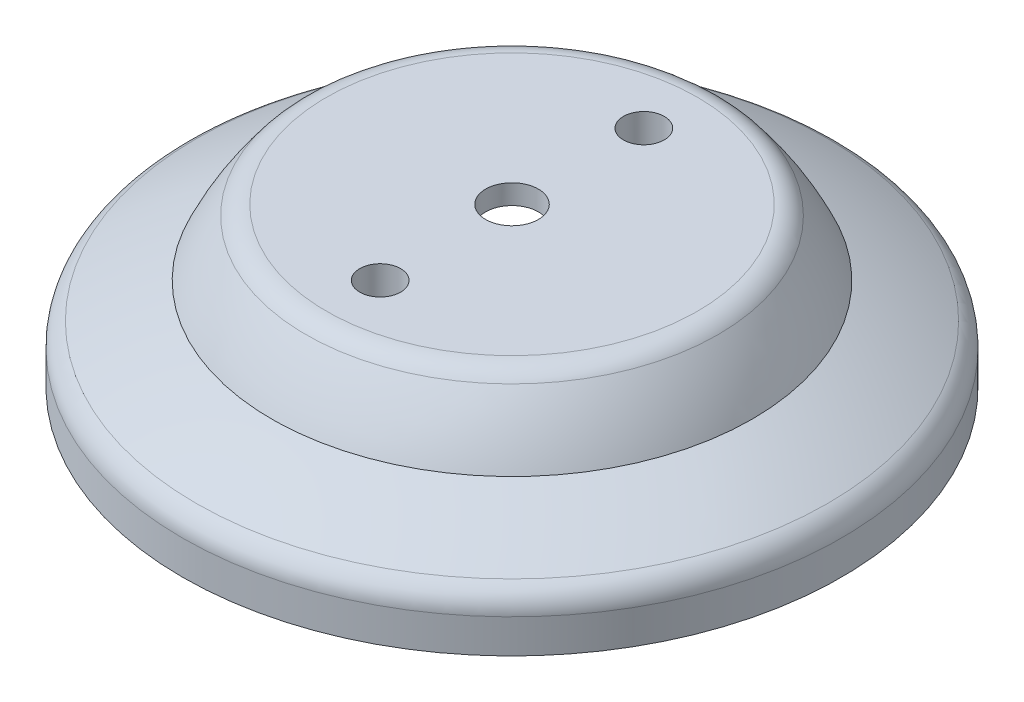
ISO-10303-21;
HEADER;
FILE_DESCRIPTION(('STEP AP214'),'2;1');
FILE_NAME('part.step','',(''),(''),'','','');
FILE_SCHEMA(('AUTOMOTIVE_DESIGN { 1 0 10303 214 1 1 1 1 }'));
ENDSEC;
DATA;
#1=APPLICATION_CONTEXT('core data for automotive mechanical design processes');
#2=APPLICATION_PROTOCOL_DEFINITION('international standard','automotive_design',2000,#1);
#3=PRODUCT_CONTEXT('',#1,'mechanical');
#4=PRODUCT('Part','Part','',(#3));
#5=PRODUCT_RELATED_PRODUCT_CATEGORY('part','',(#4));
#6=PRODUCT_DEFINITION_FORMATION('','',#4);
#7=PRODUCT_DEFINITION_CONTEXT('part definition',#1,'design');
#8=PRODUCT_DEFINITION('design','',#6,#7);
#9=PRODUCT_DEFINITION_SHAPE('','',#8);
#10=(LENGTH_UNIT() NAMED_UNIT(*) SI_UNIT(.MILLI.,.METRE.));
#11=(NAMED_UNIT(*) PLANE_ANGLE_UNIT() SI_UNIT($,.RADIAN.));
#12=(NAMED_UNIT(*) SI_UNIT($,.STERADIAN.) SOLID_ANGLE_UNIT());
#13=UNCERTAINTY_MEASURE_WITH_UNIT(LENGTH_MEASURE(1.E-05),#10,'distance_accuracy_value','');
#14=(GEOMETRIC_REPRESENTATION_CONTEXT(3) GLOBAL_UNCERTAINTY_ASSIGNED_CONTEXT((#13)) GLOBAL_UNIT_ASSIGNED_CONTEXT((#10,
#11,#12)) REPRESENTATION_CONTEXT('',''));
#15=CARTESIAN_POINT('',(0.,0.,0.));
#16=DIRECTION('',(0.,0.,1.));
#17=DIRECTION('',(1.,0.,0.));
#18=AXIS2_PLACEMENT_3D('',#15,#16,#17);
#19=CARTESIAN_POINT('',(14.3068609298467,10.5,0.));
#20=DIRECTION('',(0.,1.,0.));
#21=DIRECTION('',(-1.,0.,0.));
#22=AXIS2_PLACEMENT_3D('',#19,#20,#21);
#23=PLANE('',#22);
#24=CARTESIAN_POINT('',(0.,10.5,-10.));
#25=DIRECTION('',(0.,1.,0.));
#26=DIRECTION('',(-1.,0.,0.));
#27=AXIS2_PLACEMENT_3D('',#24,#25,#26);
#28=CIRCLE('',#27,3.05);
#29=CARTESIAN_POINT('',(-3.05,10.5,-10.));
#30=VERTEX_POINT('',#29);
#31=EDGE_CURVE('E54',#30,#30,#28,.F.);
#32=ORIENTED_EDGE('',*,*,#31,.F.);
#33=EDGE_LOOP('',(#32));
#34=FACE_BOUND('',#33,.T.);
#35=CARTESIAN_POINT('',(0.,10.5,10.));
#36=DIRECTION('',(0.,1.,0.));
#37=DIRECTION('',(-1.,0.,0.));
#38=AXIS2_PLACEMENT_3D('',#35,#36,#37);
#39=CIRCLE('',#38,3.05);
#40=CARTESIAN_POINT('',(-3.05,10.5,10.));
#41=VERTEX_POINT('',#40);
#42=EDGE_CURVE('E65',#41,#41,#39,.F.);
#43=ORIENTED_EDGE('',*,*,#42,.F.);
#44=EDGE_LOOP('',(#43));
#45=FACE_BOUND('',#44,.T.);
#46=CARTESIAN_POINT('',(0.,10.5,0.));
#47=DIRECTION('',(0.,1.,0.));
#48=DIRECTION('',(-1.,0.,0.));
#49=AXIS2_PLACEMENT_3D('',#46,#47,#48);
#50=CIRCLE('',#49,2.);
#51=CARTESIAN_POINT('',(-2.,10.5,0.));
#52=VERTEX_POINT('',#51);
#53=EDGE_CURVE('E80',#52,#52,#50,.T.);
#54=ORIENTED_EDGE('',*,*,#53,.T.);
#55=EDGE_LOOP('',(#54));
#56=FACE_BOUND('',#55,.T.);
#57=CARTESIAN_POINT('',(0.,10.5,0.));
#58=DIRECTION('',(0.,-1.,0.));
#59=DIRECTION('',(1.,0.,0.));
#60=AXIS2_PLACEMENT_3D('',#57,#58,#59);
#61=CIRCLE('',#60,14.3068609298467);
#62=CARTESIAN_POINT('',(14.3068609298467,10.5,0.));
#63=VERTEX_POINT('',#62);
#64=EDGE_CURVE('E83',#63,#63,#61,.T.);
#65=ORIENTED_EDGE('',*,*,#64,.T.);
#66=EDGE_LOOP('',(#65));
#67=FACE_BOUND('',#66,.T.);
#68=ADVANCED_FACE('F34',(#34,#45,#56,#67),#23,.F.);
#69=CARTESIAN_POINT('',(0.,10.5,0.));
#70=DIRECTION('',(0.,-1.,0.));
#71=DIRECTION('',(1.,0.,0.));
#72=AXIS2_PLACEMENT_3D('',#69,#70,#71);
#73=CYLINDRICAL_SURFACE('',#72,23.5);
#74=CARTESIAN_POINT('',(0.,2.86770806584853,0.));
#75=DIRECTION('',(0.,-1.,0.));
#76=DIRECTION('',(1.,0.,0.));
#77=AXIS2_PLACEMENT_3D('',#74,#75,#76);
#78=CIRCLE('',#77,23.5);
#79=CARTESIAN_POINT('',(23.5,2.86770806584853,0.));
#80=VERTEX_POINT('',#79);
#81=EDGE_CURVE('E90',#80,#80,#78,.T.);
#82=ORIENTED_EDGE('',*,*,#81,.F.);
#83=EDGE_LOOP('',(#82));
#84=FACE_BOUND('',#83,.T.);
#85=CARTESIAN_POINT('',(0.,0.,0.));
#86=DIRECTION('',(0.,-1.,0.));
#87=DIRECTION('',(0.,0.,-1.));
#88=AXIS2_PLACEMENT_3D('',#85,#86,#87);
#89=CIRCLE('',#88,23.5);
#90=CARTESIAN_POINT('',(0.,0.,-23.5));
#91=VERTEX_POINT('',#90);
#92=EDGE_CURVE('E58',#91,#91,#89,.T.);
#93=ORIENTED_EDGE('',*,*,#92,.T.);
#94=EDGE_LOOP('',(#93));
#95=FACE_BOUND('',#94,.T.);
#96=ADVANCED_FACE('F103',(#84,#95),#73,.F.);
#97=CARTESIAN_POINT('',(0.,-39.5586988053443,0.));
#98=DIRECTION('',(0.,-1.,0.));
#99=DIRECTION('',(1.,0.,0.));
#100=AXIS2_PLACEMENT_3D('',#97,#98,#99);
#101=SPHERICAL_SURFACE('',#100,48.5);
#102=CARTESIAN_POINT('',(0.,5.82598309941426,0.));
#103=DIRECTION('',(0.,-1.,0.));
#104=DIRECTION('',(1.,0.,0.));
#105=AXIS2_PLACEMENT_3D('',#102,#103,#104);
#106=CIRCLE('',#105,17.1020656180439);
#107=CARTESIAN_POINT('',(17.1020656180439,5.82598309941426,0.));
#108=VERTEX_POINT('',#107);
#109=EDGE_CURVE('E93',#108,#108,#106,.T.);
#110=CARTESIAN_POINT('',(17.1020656180439,5.82598309941426,0.));
#111=CARTESIAN_POINT('',(17.1708344650516,5.80006930593751,0.));
#112=CARTESIAN_POINT('',(17.2395444126264,5.77399920785923,0.));
#113=CARTESIAN_POINT('',(17.376845091056,5.72154694628821,0.));
#114=CARTESIAN_POINT('',(17.4454358219109,5.69516478279548,0.));
#115=CARTESIAN_POINT('',(17.5824966490466,5.64208893418415,0.));
#116=CARTESIAN_POINT('',(17.6509667453274,5.61539524906555,0.));
#117=CARTESIAN_POINT('',(17.7877848886135,5.56169690915612,0.));
#118=CARTESIAN_POINT('',(17.8561329356189,5.53469225436528,0.));
#119=CARTESIAN_POINT('',(17.9927055679979,5.48037253302775,0.));
#120=CARTESIAN_POINT('',(18.0609301533715,5.45305746648107,0.));
#121=CARTESIAN_POINT('',(18.1972544527294,5.39811748608653,0.));
#122=CARTESIAN_POINT('',(18.2653541667137,5.37049257223869,0.));
#123=CARTESIAN_POINT('',(18.4014273161028,5.31493346806585,0.));
#124=CARTESIAN_POINT('',(18.4694007515077,5.28699927774086,0.));
#125=CARTESIAN_POINT('',(18.6052199391606,5.23082219783745,0.));
#126=CARTESIAN_POINT('',(18.6730656914086,5.20257930825901,0.));
#127=CARTESIAN_POINT('',(18.8086281108082,5.14578541344887,0.));
#128=CARTESIAN_POINT('',(18.8763447779597,5.11723440821716,0.));
#129=CARTESIAN_POINT('',(19.0116476278938,5.05982487206804,0.));
#130=CARTESIAN_POINT('',(19.0792338106765,5.03096634115064,0.));
#131=CARTESIAN_POINT('',(19.2142742952971,4.97294234995216,0.));
#132=CARTESIAN_POINT('',(19.281728597135,4.94377688967108,0.));
#133=CARTESIAN_POINT('',(19.4165039260152,4.88513964240957,0.));
#134=CARTESIAN_POINT('',(19.4838249530575,4.85566785542914,0.));
#135=CARTESIAN_POINT('',(19.6183323412495,4.7964185637631,0.));
#136=CARTESIAN_POINT('',(19.6855187023992,4.76664105907748,0.));
#137=CARTESIAN_POINT('',(19.819755370492,4.70678094731243,0.));
#138=CARTESIAN_POINT('',(19.886805677435,4.67669834023301,0.));
#139=CARTESIAN_POINT('',(20.0207688516114,4.61622864529625,0.));
#140=CARTESIAN_POINT('',(20.0876817188448,4.58584155743893,0.));
#141=CARTESIAN_POINT('',(20.2213686309392,4.52476352885396,0.));
#142=CARTESIAN_POINT('',(20.2881426758002,4.49407258812632,0.));
#143=CARTESIAN_POINT('',(20.4215505633555,4.43238748798702,0.));
#144=CARTESIAN_POINT('',(20.4881844060498,4.40139332857536,0.));
#145=CARTESIAN_POINT('',(20.6213105123746,4.33910243151991,0.));
#146=CARTESIAN_POINT('',(20.6878027760051,4.30780569387612,0.));
#147=CARTESIAN_POINT('',(20.8206443502305,4.24491028706068,0.));
#148=CARTESIAN_POINT('',(20.8869936608254,4.21331161788903,0.));
#149=CARTESIAN_POINT('',(21.0195479579621,4.14981300096111,0.));
#150=CARTESIAN_POINT('',(21.0857529445039,4.11791305320484,0.));
#151=CARTESIAN_POINT('',(21.2180172254987,4.05381253827645,0.));
#152=CARTESIAN_POINT('',(21.2840765199518,4.02161197110433,0.));
#153=CARTESIAN_POINT('',(21.4160480517444,3.95691088272491,0.));
#154=CARTESIAN_POINT('',(21.4819602890839,3.92441036151761,0.));
#155=CARTESIAN_POINT('',(21.6136363446631,3.85911003664661,0.));
#156=CARTESIAN_POINT('',(21.6794001629029,3.82631023298292,0.));
#157=CARTESIAN_POINT('',(21.8107780213633,3.76041202096221,0.));
#158=CARTESIAN_POINT('',(21.8763920615839,3.72731361260521,0.));
#159=CARTESIAN_POINT('',(22.0074690081818,3.66081887513108,0.));
#160=CARTESIAN_POINT('',(22.0729319145589,3.62742254601396,0.));
#161=CARTESIAN_POINT('',(22.2037052407687,3.56033265710951,0.));
#162=CARTESIAN_POINT('',(22.2690156606012,3.52663909732219,0.));
#163=CARTESIAN_POINT('',(22.3994826641703,3.45895544330689,0.));
#164=CARTESIAN_POINT('',(22.4646392479068,3.4249653490789,0.));
#165=CARTESIAN_POINT('',(22.5947972329158,3.35668932854765,0.));
#166=CARTESIAN_POINT('',(22.6597986341883,3.32240340224438,0.));
#167=CARTESIAN_POINT('',(22.7896449110907,3.2535364260097,0.));
#168=CARTESIAN_POINT('',(22.8544897867206,3.21895537607828,0.));
#169=CARTESIAN_POINT('',(22.9840216724575,3.14949886724923,0.));
#170=CARTESIAN_POINT('',(23.0487086825646,3.1146234083516,0.));
#171=CARTESIAN_POINT('',(23.1779235003995,3.04457880190097,0.));
#172=CARTESIAN_POINT('',(23.2424513081273,3.00940965434797,0.));
#173=CARTESIAN_POINT('',(23.3713463885259,2.93877839858818,0.));
#174=CARTESIAN_POINT('',(23.4357136611967,2.9033162903814,0.));
#175=CARTESIAN_POINT('',(23.5,2.86770806584853,0.));
#176=B_SPLINE_CURVE_WITH_KNOTS('',3,(#110,#111,#112,#113,#114,#115,#116,#117,#118,#119,#120,
#121,#122,#123,#124,#125,#126,#127,#128,#129,#130,#131,#132,#133,#134,#135,#136,#137,#138,#139,
#140,#141,#142,#143,#144,#145,#146,#147,#148,#149,#150,#151,#152,#153,#154,#155,#156,#157,#158,
#159,#160,#161,#162,#163,#164,#165,#166,#167,#168,#169,#170,#171,#172,#173,#174,#175),
.UNSPECIFIED.,.F.,.F.,(4,2,2,2,2,2,2,2,2,2,2,2,2,2,2,2,2,2,2,2,2,2,2,2,2,2,2,2,2,2,2,2,4),(0.,
0.22046774683508,0.440935493670154,0.661403240505227,0.881870987340309,1.10233873417539,
1.32280648101046,1.54327422784553,1.76374197468062,1.9842097215157,2.20467746835077,
2.42514521518584,2.64561296202092,2.866080708856,3.08654845569107,3.30701620252615,
3.52748394936123,3.74795169619631,3.96841944303139,4.18888718986646,4.40935493670153,
4.62982268353662,4.85029043037169,5.07075817720676,5.29122592404184,5.51169367087692,
5.732161417712,5.95262916454707,6.17309691138215,6.39356465821723,6.61403240505231,
6.83450015188738,7.05496789872246),.UNSPECIFIED.);
#177=EDGE_CURVE('BSEAM132',#108,#80,#176,.T.);
#178=ORIENTED_EDGE('',*,*,#109,.F.);
#179=ORIENTED_EDGE('',*,*,#81,.T.);
#180=ORIENTED_EDGE('',*,*,#177,.T.);
#181=ORIENTED_EDGE('',*,*,#177,.F.);
#182=EDGE_LOOP('',(#178,#180,#179,#181));
#183=FACE_BOUND('',#182,.T.);
#184=ADVANCED_FACE('F132',(#183),#101,.F.);
#185=CARTESIAN_POINT('',(0.,-1.22875655532296,0.));
#186=DIRECTION('',(0.,-1.,0.));
#187=DIRECTION('',(1.,0.,0.));
#188=AXIS2_PLACEMENT_3D('',#185,#186,#187);
#189=SPHERICAL_SURFACE('',#188,18.5000000000001);
#190=CARTESIAN_POINT('',(14.3068609298467,10.5,0.));
#191=CARTESIAN_POINT('',(14.3429580487021,10.4559683664557,0.));
#192=CARTESIAN_POINT('',(14.3788518837041,10.4117700810889,0.));
#193=CARTESIAN_POINT('',(14.4502299536883,10.3230439966468,0.));
#194=CARTESIAN_POINT('',(14.4857141886707,10.2785161975714,0.));
#195=CARTESIAN_POINT('',(14.5562700263033,10.1891348756487,0.));
#196=CARTESIAN_POINT('',(14.5913416289535,10.1442813528014,0.));
#197=CARTESIAN_POINT('',(14.6610692141411,10.054252408565,0.));
#198=CARTESIAN_POINT('',(14.6957251966785,10.0090769871759,0.));
#199=CARTESIAN_POINT('',(14.7646185867832,9.91840809651063,0.));
#200=CARTESIAN_POINT('',(14.7988559943505,9.8729146272344,0.));
#201=CARTESIAN_POINT('',(14.866909316012,9.78161351910238,0.));
#202=CARTESIAN_POINT('',(14.9007252301062,9.73580588024659,0.));
#203=CARTESIAN_POINT('',(14.9679326820696,9.64388033790037,0.));
#204=CARTESIAN_POINT('',(15.0013242199387,9.59776243440993,0.));
#205=CARTESIAN_POINT('',(15.0676800729252,9.50522029422734,0.));
#206=CARTESIAN_POINT('',(15.1006443880425,9.45879605753517,0.));
#207=CARTESIAN_POINT('',(15.1661429854051,9.36564520848571,0.));
#208=CARTESIAN_POINT('',(15.1986772676505,9.31891859612842,0.));
#209=CARTESIAN_POINT('',(15.2633130258116,9.22516697906476,0.));
#210=CARTESIAN_POINT('',(15.2954145017274,9.17814197435839,0.));
#211=CARTESIAN_POINT('',(15.3591819106666,9.08379758134905,0.));
#212=CARTESIAN_POINT('',(15.3908478436899,9.03647819304608,0.));
#213=CARTESIAN_POINT('',(15.4537414674103,8.94154906669156,0.));
#214=CARTESIAN_POINT('',(15.4849691581074,8.89393932864002,0.));
#215=CARTESIAN_POINT('',(15.5469836351002,8.79843356138789,0.));
#216=CARTESIAN_POINT('',(15.577770421396,8.75053753218729,0.));
#217=CARTESIAN_POINT('',(15.6389004650973,8.65446326564212,0.));
#218=CARTESIAN_POINT('',(15.6692437225028,8.60628502829754,0.));
#219=CARTESIAN_POINT('',(15.729484121744,8.50965045252691,0.));
#220=CARTESIAN_POINT('',(15.7593812635798,8.46119411410086,0.));
#221=CARTESIAN_POINT('',(15.8187268830323,8.36400746693719,0.));
#222=CARTESIAN_POINT('',(15.848175360649,8.31527715819957,0.));
#223=CARTESIAN_POINT('',(15.9066211412615,8.21754672453785,0.));
#224=CARTESIAN_POINT('',(15.9356184442573,8.16854659961374,0.));
#225=CARTESIAN_POINT('',(15.9931594036874,8.07028071070525,0.));
#226=CARTESIAN_POINT('',(16.0217030601218,8.02101494672086,0.));
#227=CARTESIAN_POINT('',(16.0783342931606,7.92222197946298,0.));
#228=CARTESIAN_POINT('',(16.1064218697651,7.87269477618949,0.));
#229=CARTESIAN_POINT('',(16.1621385487554,7.77338315241159,0.));
#230=CARTESIAN_POINT('',(16.1897676511413,7.72359873190718,0.));
#231=CARTESIAN_POINT('',(16.2445650263891,7.62377691765266,0.));
#232=CARTESIAN_POINT('',(16.2717332992511,7.57373952390255,0.));
#233=CARTESIAN_POINT('',(16.3256066994306,7.47341602870717,0.));
#234=CARTESIAN_POINT('',(16.352311826748,7.42312992726189,0.));
#235=CARTESIAN_POINT('',(16.4052566592996,7.3223133034283,0.));
#236=CARTESIAN_POINT('',(16.4314963645336,7.27178278103998,0.));
#237=CARTESIAN_POINT('',(16.4835081160557,7.17048162290878,0.));
#238=CARTESIAN_POINT('',(16.5092801623437,7.11971098716589,0.));
#239=CARTESIAN_POINT('',(16.5603543989766,7.01793393038256,0.));
#240=CARTESIAN_POINT('',(16.5856565893215,6.96692750934212,0.));
#241=CARTESIAN_POINT('',(16.635788957129,6.86468323012248,0.));
#242=CARTESIAN_POINT('',(16.6606191345917,6.81344537194328,0.));
#243=CARTESIAN_POINT('',(16.7098053599183,6.71074258632783,0.));
#244=CARTESIAN_POINT('',(16.7341614077822,6.65927765889157,0.));
#245=CARTESIAN_POINT('',(16.78239729767,6.55612512202489,0.));
#246=CARTESIAN_POINT('',(16.8062771396939,6.50443751259446,0.));
#247=CARTESIAN_POINT('',(16.8535585820429,6.40084401789526,0.));
#248=CARTESIAN_POINT('',(16.876960182368,6.34893813262649,0.));
#249=CARTESIAN_POINT('',(16.9232831470232,6.24491251134998,0.));
#250=CARTESIAN_POINT('',(16.9462045113534,6.19279277534224,0.));
#251=CARTESIAN_POINT('',(16.9915650476987,6.08834389466298,0.));
#252=CARTESIAN_POINT('',(17.0140042197138,6.03601474999146,0.));
#253=CARTESIAN_POINT('',(17.0583984672721,5.93115151659266,0.));
#254=CARTESIAN_POINT('',(17.0803535428153,5.87861742786539,0.));
#255=CARTESIAN_POINT('',(17.102065618044,5.82598309941425,0.));
#256=B_SPLINE_CURVE_WITH_KNOTS('',3,(#190,#191,#192,#193,#194,#195,#196,#197,#198,#199,#200,
#201,#202,#203,#204,#205,#206,#207,#208,#209,#210,#211,#212,#213,#214,#215,#216,#217,#218,#219,
#220,#221,#222,#223,#224,#225,#226,#227,#228,#229,#230,#231,#232,#233,#234,#235,#236,#237,#238,
#239,#240,#241,#242,#243,#244,#245,#246,#247,#248,#249,#250,#251,#252,#253,#254,#255),
.UNSPECIFIED.,.F.,.F.,(4,2,2,2,2,2,2,2,2,2,2,2,2,2,2,2,2,2,2,2,2,2,2,2,2,2,2,2,2,2,2,2,4),(0.,
0.170809465019986,0.34161893003997,0.512428395059957,0.683237860079943,0.854047325099928,
1.02485679011991,1.1956662551399,1.36647572015988,1.53728518517987,1.70809465019985,
1.87890411521984,2.04971358023983,2.22052304525981,2.3913325102798,2.56214197529978,
2.73295144031977,2.90376090533975,3.07457037035974,3.24537983537972,3.41618930039971,
3.5869987654197,3.75780823043968,3.92861769545967,4.09942716047965,4.27023662549964,
4.44104609051962,4.61185555553961,4.78266502055959,4.95347448557958,5.12428395059956,
5.29509341561955,5.46590288063954),.UNSPECIFIED.);
#257=EDGE_CURVE('BSEAM144',#63,#108,#256,.T.);
#258=ORIENTED_EDGE('',*,*,#64,.F.);
#259=ORIENTED_EDGE('',*,*,#109,.T.);
#260=ORIENTED_EDGE('',*,*,#257,.T.);
#261=ORIENTED_EDGE('',*,*,#257,.F.);
#262=EDGE_LOOP('',(#258,#260,#259,#261));
#263=FACE_BOUND('',#262,.T.);
#264=ADVANCED_FACE('F144',(#263),#189,.F.);
#265=CARTESIAN_POINT('',(0.,6.,0.));
#266=DIRECTION('',(0.,1.,0.));
#267=DIRECTION('',(0.,0.,1.));
#268=AXIS2_PLACEMENT_3D('',#265,#266,#267);
#269=CYLINDRICAL_SURFACE('',#268,2.);
#270=CARTESIAN_POINT('',(0.,12.,0.));
#271=DIRECTION('',(0.,1.,0.));
#272=DIRECTION('',(0.,0.,1.));
#273=AXIS2_PLACEMENT_3D('',#270,#271,#272);
#274=CIRCLE('',#273,2.);
#275=CARTESIAN_POINT('',(0.,12.,2.));
#276=VERTEX_POINT('',#275);
#277=EDGE_CURVE('E84',#276,#276,#274,.T.);
#278=ORIENTED_EDGE('',*,*,#277,.T.);
#279=EDGE_LOOP('',(#278));
#280=FACE_BOUND('',#279,.T.);
#281=ORIENTED_EDGE('',*,*,#53,.F.);
#282=EDGE_LOOP('',(#281));
#283=FACE_BOUND('',#282,.T.);
#284=ADVANCED_FACE('F111',(#280,#283),#269,.F.);
#285=CARTESIAN_POINT('',(0.,12.,0.));
#286=DIRECTION('',(0.,-1.,0.));
#287=DIRECTION('',(0.,0.,-1.));
#288=AXIS2_PLACEMENT_3D('',#285,#286,#287);
#289=PLANE('',#288);
#290=CARTESIAN_POINT('',(0.,12.,0.));
#291=DIRECTION('',(0.,-1.,0.));
#292=DIRECTION('',(0.,0.,-1.));
#293=AXIS2_PLACEMENT_3D('',#290,#291,#292);
#294=CIRCLE('',#293,14.068227543699);
#295=CARTESIAN_POINT('',(0.,12.,-14.068227543699));
#296=VERTEX_POINT('',#295);
#297=EDGE_CURVE('E45',#296,#296,#294,.F.);
#298=ORIENTED_EDGE('',*,*,#297,.T.);
#299=EDGE_LOOP('',(#298));
#300=FACE_BOUND('',#299,.T.);
#301=CARTESIAN_POINT('',(0.,12.,-10.));
#302=DIRECTION('',(0.,-1.,0.));
#303=DIRECTION('',(0.,0.,-1.));
#304=AXIS2_PLACEMENT_3D('',#301,#302,#303);
#305=CIRCLE('',#304,1.55);
#306=CARTESIAN_POINT('',(0.,12.,-11.55));
#307=VERTEX_POINT('',#306);
#308=EDGE_CURVE('E55',#307,#307,#305,.T.);
#309=ORIENTED_EDGE('',*,*,#308,.T.);
#310=EDGE_LOOP('',(#309));
#311=FACE_BOUND('',#310,.T.);
#312=CARTESIAN_POINT('',(0.,12.,10.));
#313=DIRECTION('',(0.,-1.,0.));
#314=DIRECTION('',(0.,0.,-1.));
#315=AXIS2_PLACEMENT_3D('',#312,#313,#314);
#316=CIRCLE('',#315,1.55);
#317=CARTESIAN_POINT('',(0.,12.,8.45));
#318=VERTEX_POINT('',#317);
#319=EDGE_CURVE('E59',#318,#318,#316,.T.);
#320=ORIENTED_EDGE('',*,*,#319,.T.);
#321=EDGE_LOOP('',(#320));
#322=FACE_BOUND('',#321,.T.);
#323=ORIENTED_EDGE('',*,*,#277,.F.);
#324=EDGE_LOOP('',(#323));
#325=FACE_BOUND('',#324,.T.);
#326=ADVANCED_FACE('F122',(#300,#311,#322,#325),#289,.F.);
#327=CARTESIAN_POINT('',(0.,-1.22875655532296,0.));
#328=DIRECTION('',(0.,-1.,0.));
#329=DIRECTION('',(1.,0.,0.));
#330=AXIS2_PLACEMENT_3D('',#327,#328,#329);
#331=SPHERICAL_SURFACE('',#330,20.);
#332=CARTESIAN_POINT('',(0.,11.2476396172581,0.));
#333=DIRECTION('',(0.,-1.,0.));
#334=DIRECTION('',(0.,0.,-1.));
#335=AXIS2_PLACEMENT_3D('',#332,#333,#334);
#336=CIRCLE('',#335,15.6313639374434);
#337=CARTESIAN_POINT('',(15.6313639374434,11.2476396172581,0.));
#338=VERTEX_POINT('',#337);
#339=EDGE_CURVE('E49',#338,#338,#336,.T.);
#340=CARTESIAN_POINT('',(0.,7.,0.));
#341=DIRECTION('',(0.,-1.,0.));
#342=DIRECTION('',(0.,0.,-1.));
#343=AXIS2_PLACEMENT_3D('',#340,#341,#342);
#344=CIRCLE('',#343,18.228756555323);
#345=CARTESIAN_POINT('',(18.228756555323,7.,0.));
#346=VERTEX_POINT('',#345);
#347=EDGE_CURVE('E75',#346,#346,#344,.T.);
#348=CARTESIAN_POINT('',(15.6313639374434,11.2476396172581,0.));
#349=CARTESIAN_POINT('',(15.663801213109,11.2069997749948,0.));
#350=CARTESIAN_POINT('',(15.6960799931759,11.1662334272843,0.));
#351=CARTESIAN_POINT('',(15.7603186137479,11.0844502129928,0.));
#352=CARTESIAN_POINT('',(15.7922784542529,11.0434333464119,0.));
#353=CARTESIAN_POINT('',(15.8558772473369,10.9611515864037,0.));
#354=CARTESIAN_POINT('',(15.8875161999158,10.9198866929764,0.));
#355=CARTESIAN_POINT('',(15.9504712935032,10.8371113904715,0.));
#356=CARTESIAN_POINT('',(15.9817874345117,10.7956009813939,0.));
#357=CARTESIAN_POINT('',(16.044094999559,10.7123371726263,0.));
#358=CARTESIAN_POINT('',(16.0750864235977,10.6705837729363,0.));
#359=CARTESIAN_POINT('',(16.1367426694337,10.5868365230571,0.));
#360=CARTESIAN_POINT('',(16.1674074912308,10.5448426728679,0.));
#361=CARTESIAN_POINT('',(16.2284086670802,10.4606170766528,0.));
#362=CARTESIAN_POINT('',(16.2587450211324,10.4183853306269,0.));
#363=CARTESIAN_POINT('',(16.3190874159978,10.333686511894,0.));
#364=CARTESIAN_POINT('',(16.3490934568109,10.2912194391871,0.));
#365=CARTESIAN_POINT('',(16.408773399791,10.2060525505583,0.));
#366=CARTESIAN_POINT('',(16.438447301958,10.1633527346364,0.));
#367=CARTESIAN_POINT('',(16.4974611624464,10.0777229572043,0.));
#368=CARTESIAN_POINT('',(16.5268011207679,10.034792995694,0.));
#369=CARTESIAN_POINT('',(16.5851453086804,9.94870553871186,0.));
#370=CARTESIAN_POINT('',(16.6141495382715,9.90554804324002,0.));
#371=CARTESIAN_POINT('',(16.6718205042629,9.81900814380369,0.));
#372=CARTESIAN_POINT('',(16.7004872406631,9.7756257398392,0.));
#373=CARTESIAN_POINT('',(16.7574814763432,9.6886386625687,0.));
#374=CARTESIAN_POINT('',(16.7858089756231,9.64503398926268,0.));
#375=CARTESIAN_POINT('',(16.8421230137705,9.55760502598191,0.));
#376=CARTESIAN_POINT('',(16.8701095526381,9.51378073600714,0.));
#377=CARTESIAN_POINT('',(16.925739967411,9.42591520542194,0.));
#378=CARTESIAN_POINT('',(16.9533838433163,9.38187396481151,0.));
#379=CARTESIAN_POINT('',(17.0083272504608,9.29357721218614,0.));
#380=CARTESIAN_POINT('',(17.0356267816998,9.2493217001712,0.));
#381=CARTESIAN_POINT('',(17.0898798387557,9.16059909700314,0.));
#382=CARTESIAN_POINT('',(17.1168333645725,9.11613200585,0.));
#383=CARTESIAN_POINT('',(17.1703927710768,9.02698894954315,0.));
#384=CARTESIAN_POINT('',(17.1969986517644,8.98231298438944,0.));
#385=CARTESIAN_POINT('',(17.2498611494522,8.89275489792582,0.));
#386=CARTESIAN_POINT('',(17.2761177664525,8.84787277661592,0.));
#387=CARTESIAN_POINT('',(17.3282801394551,8.75790510822575,0.));
#388=CARTESIAN_POINT('',(17.3541858954574,8.71281956114548,0.));
#389=CARTESIAN_POINT('',(17.4056449704977,8.62244778397571,0.));
#390=CARTESIAN_POINT('',(17.4311982895357,8.57716155388621,0.));
#391=CARTESIAN_POINT('',(17.4819509361215,8.4863911656676,0.));
#392=CARTESIAN_POINT('',(17.5071502636694,8.44090700753849,0.));
#393=CARTESIAN_POINT('',(17.5571933942839,8.34974353025113,0.));
#394=CARTESIAN_POINT('',(17.5820371973505,8.30406421109288,0.));
#395=CARTESIAN_POINT('',(17.6313677676401,8.21251319063032,0.));
#396=CARTESIAN_POINT('',(17.6558545348629,8.16664148932602,0.));
#397=CARTESIAN_POINT('',(17.7044695438217,8.07470849515765,0.));
#398=CARTESIAN_POINT('',(17.7285977855576,8.0286472022936,0.));
#399=CARTESIAN_POINT('',(17.7764942757123,7.93633782712678,0.));
#400=CARTESIAN_POINT('',(17.8002625241312,7.89008974482403,0.));
#401=CARTESIAN_POINT('',(17.8474375817134,7.79740960426031,0.));
#402=CARTESIAN_POINT('',(17.8708443908768,7.75097754599934,0.));
#403=CARTESIAN_POINT('',(17.9172951460287,7.65793227820607,0.));
#404=CARTESIAN_POINT('',(17.9403390920172,7.61131906867375,0.));
#405=CARTESIAN_POINT('',(17.986062718859,7.51791433399167,0.));
#406=CARTESIAN_POINT('',(18.0087423997124,7.4711228088419,0.));
#407=CARTESIAN_POINT('',(18.0537361169146,7.37736428962522,0.));
#408=CARTESIAN_POINT('',(18.0760501532634,7.3303972955583,0.));
#409=CARTESIAN_POINT('',(18.1203112227225,7.23629069514081,0.));
#410=CARTESIAN_POINT('',(18.1422582558326,7.18915108879025,0.));
#411=CARTESIAN_POINT('',(18.1857839884105,7.09470213370666,0.));
#412=CARTESIAN_POINT('',(18.2073626878783,7.04739278497364,0.));
#413=CARTESIAN_POINT('',(18.228756555323,7.,0.));
#414=B_SPLINE_CURVE_WITH_KNOTS('',3,(#348,#349,#350,#351,#352,#353,#354,#355,#356,#357,#358,
#359,#360,#361,#362,#363,#364,#365,#366,#367,#368,#369,#370,#371,#372,#373,#374,#375,#376,#377,
#378,#379,#380,#381,#382,#383,#384,#385,#386,#387,#388,#389,#390,#391,#392,#393,#394,#395,#396,
#397,#398,#399,#400,#401,#402,#403,#404,#405,#406,#407,#408,#409,#410,#411,#412,#413),
.UNSPECIFIED.,.F.,.F.,(4,2,2,2,2,2,2,2,2,2,2,2,2,2,2,2,2,2,2,2,2,2,2,2,2,2,2,2,2,2,2,2,4),(0.,
0.1559930745009,0.311986149001795,0.467979223502693,0.623972298003591,0.779965372504489,
0.935958447005386,1.09195152150628,1.24794459600718,1.40393767050808,1.55993074500897,
1.71592381950987,1.87191689401077,2.02790996851167,2.18390304301257,2.33989611751347,
2.49588919201436,2.65188226651526,2.80787534101616,2.96386841551706,3.11986149001796,
3.27585456451885,3.43184763901975,3.58784071352065,3.74383378802154,3.89982686252244,
4.05581993702334,4.21181301152424,4.36780608602514,4.52379916052603,4.67979223502693,
4.83578530952783,4.99177838402873),.UNSPECIFIED.);
#415=EDGE_CURVE('BSEAM117',#338,#346,#414,.T.);
#416=ORIENTED_EDGE('',*,*,#339,.T.);
#417=ORIENTED_EDGE('',*,*,#347,.F.);
#418=ORIENTED_EDGE('',*,*,#415,.T.);
#419=ORIENTED_EDGE('',*,*,#415,.F.);
#420=EDGE_LOOP('',(#416,#418,#417,#419));
#421=FACE_BOUND('',#420,.T.);
#422=ADVANCED_FACE('F117',(#421),#331,.T.);
#423=CARTESIAN_POINT('',(0.,-39.5586988053443,0.));
#424=DIRECTION('',(0.,-1.,0.));
#425=DIRECTION('',(1.,0.,0.));
#426=AXIS2_PLACEMENT_3D('',#423,#424,#425);
#427=SPHERICAL_SURFACE('',#426,50.);
#428=CARTESIAN_POINT('',(0.,4.32749792994921,0.));
#429=DIRECTION('',(0.,-1.,0.));
#430=DIRECTION('',(0.,0.,-1.));
#431=AXIS2_PLACEMENT_3D('',#428,#429,#430);
#432=CIRCLE('',#431,23.9583333333333);
#433=CARTESIAN_POINT('',(23.9583333333333,4.32749792994922,0.));
#434=VERTEX_POINT('',#433);
#435=EDGE_CURVE('E11',#434,#434,#432,.F.);
#436=CARTESIAN_POINT('',(23.9583333333333,4.32749792994922,0.));
#437=CARTESIAN_POINT('',(23.9004910746039,4.35907515137776,0.));
#438=CARTESIAN_POINT('',(23.8425863867532,4.3905380168989,0.));
#439=CARTESIAN_POINT('',(23.7266530596329,4.45323454705476,0.));
#440=CARTESIAN_POINT('',(23.6686244203634,4.48446821168948,0.));
#441=CARTESIAN_POINT('',(23.5524440972291,4.5467058510009,0.));
#442=CARTESIAN_POINT('',(23.4942924133643,4.57770982567759,0.));
#443=CARTESIAN_POINT('',(23.3778669103063,4.63948760055254,0.));
#444=CARTESIAN_POINT('',(23.319593091113,4.67026140075079,0.));
#445=CARTESIAN_POINT('',(23.2029242284349,4.73157834548975,0.));
#446=CARTESIAN_POINT('',(23.14452918495,4.76212149003047,0.));
#447=CARTESIAN_POINT('',(23.0276187866583,4.82297664595033,0.));
#448=CARTESIAN_POINT('',(22.9691034318514,4.85328865732947,0.));
#449=CARTESIAN_POINT('',(22.8519533257561,4.91368107301727,0.));
#450=CARTESIAN_POINT('',(22.7933185744676,4.94376147732594,0.));
#451=CARTESIAN_POINT('',(22.6759305921191,5.00369020858981,0.));
#452=CARTESIAN_POINT('',(22.617177361059,5.03353853554503,0.));
#453=CARTESIAN_POINT('',(22.4995533377286,5.09300264544607,0.));
#454=CARTESIAN_POINT('',(22.4406825454583,5.1226184283919,0.));
#455=CARTESIAN_POINT('',(22.3228243201071,5.18161698725421,0.));
#456=CARTESIAN_POINT('',(22.2638368870263,5.21099976317071,0.));
#457=CARTESIAN_POINT('',(22.1457463022772,5.26953184859722,0.));
#458=CARTESIAN_POINT('',(22.086643150609,5.29868115810725,0.));
#459=CARTESIAN_POINT('',(21.9683220527175,5.35674585499376,0.));
#460=CARTESIAN_POINT('',(21.9091041064943,5.38566124237025,0.));
#461=CARTESIAN_POINT('',(21.79055434532,5.44325764291983,0.));
#462=CARTESIAN_POINT('',(21.7312225303689,5.47193865609293,0.));
#463=CARTESIAN_POINT('',(21.6124459593461,5.52906585983011,0.));
#464=CARTESIAN_POINT('',(21.5530012032744,5.5575120503942,0.));
#465=CARTESIAN_POINT('',(21.4339996793837,5.61416916417904,0.));
#466=CARTESIAN_POINT('',(21.3744429115645,5.64238008739978,0.));
#467=CARTESIAN_POINT('',(21.2552182953031,5.69856622544182,0.));
#468=CARTESIAN_POINT('',(21.1955504468609,5.72654144026312,0.));
#469=CARTESIAN_POINT('',(21.0761046022141,5.78225572413527,0.));
#470=CARTESIAN_POINT('',(21.0163266060097,5.80999479318612,0.));
#471=CARTESIAN_POINT('',(20.8966614004216,5.86523635183835,0.));
#472=CARTESIAN_POINT('',(20.8367741910381,5.89273884143973,0.));
#473=CARTESIAN_POINT('',(20.7168914953823,5.94750681121271,0.));
#474=CARTESIAN_POINT('',(20.65689600911,5.97477229138431,0.));
#475=CARTESIAN_POINT('',(20.5367976976603,6.02906581602291,0.));
#476=CARTESIAN_POINT('',(20.4766948724828,6.05609386048991,0.));
#477=CARTESIAN_POINT('',(20.356382822884,6.10991209115658,0.));
#478=CARTESIAN_POINT('',(20.2961735984627,6.13670227735626,0.));
#479=CARTESIAN_POINT('',(20.1756496917013,6.19004437264431,0.));
#480=CARTESIAN_POINT('',(20.1153350093612,6.21659628173269,0.));
#481=CARTESIAN_POINT('',(19.9946011297358,6.26946140767945,0.));
#482=CARTESIAN_POINT('',(19.9341819324506,6.29577462453783,0.));
#483=CARTESIAN_POINT('',(19.8132399675427,6.34816195463768,0.));
#484=CARTESIAN_POINT('',(19.7527171999201,6.37423606787915,0.));
#485=CARTESIAN_POINT('',(19.6315690405645,6.42614478309636,0.));
#486=CARTESIAN_POINT('',(19.5709436488315,6.45197938507211,0.));
#487=CARTESIAN_POINT('',(19.4495911890866,6.50340867385403,0.));
#488=CARTESIAN_POINT('',(19.3888641210747,6.5290033606602,0.));
#489=CARTESIAN_POINT('',(19.2673092581926,6.5799524189486,0.));
#490=CARTESIAN_POINT('',(19.2064814633224,6.60530679043082,0.));
#491=CARTESIAN_POINT('',(19.0847260977213,6.65577482167933,0.));
#492=CARTESIAN_POINT('',(19.0237985269903,6.6808884814456,0.));
#493=CARTESIAN_POINT('',(18.9018445622173,6.73087469661405,0.));
#494=CARTESIAN_POINT('',(18.8408181681752,6.75574725201622,0.));
#495=CARTESIAN_POINT('',(18.7186675109035,6.80525086965061,0.));
#496=CARTESIAN_POINT('',(18.6575432476738,6.82988193188284,0.));
#497=CARTESIAN_POINT('',(18.5351978075728,6.87890217787513,0.));
#498=CARTESIAN_POINT('',(18.4739766307015,6.90329136163521,0.));
#499=CARTESIAN_POINT('',(18.3514383207803,6.95182747017747,0.));
#500=CARTESIAN_POINT('',(18.2901211877305,6.97597439495965,0.));
#501=CARTESIAN_POINT('',(18.2287565553229,7.00000000000001,0.));
#502=B_SPLINE_CURVE_WITH_KNOTS('',3,(#436,#437,#438,#439,#440,#441,#442,#443,#444,#445,#446,
#447,#448,#449,#450,#451,#452,#453,#454,#455,#456,#457,#458,#459,#460,#461,#462,#463,#464,#465,
#466,#467,#468,#469,#470,#471,#472,#473,#474,#475,#476,#477,#478,#479,#480,#481,#482,#483,#484,
#485,#486,#487,#488,#489,#490,#491,#492,#493,#494,#495,#496,#497,#498,#499,#500,#501),
.UNSPECIFIED.,.F.,.F.,(4,2,2,2,2,2,2,2,2,2,2,2,2,2,2,2,2,2,2,2,2,2,2,2,2,2,2,2,2,2,2,2,4),(0.,
0.19770073178026,0.395401463560526,0.59310219534079,0.790802927121051,0.98850365890132,
1.18620439068158,1.38390512246184,1.58160585424211,1.77930658602237,1.97700731780263,
2.1747080495829,2.37240878136316,2.57010951314342,2.76781024492369,2.96551097670395,
3.16321170848422,3.36091244026448,3.55861317204474,3.75631390382501,3.95401463560527,
4.15171536738553,4.3494160991658,4.54711683094606,4.74481756272633,4.94251829450659,
5.14021902628686,5.33791975806712,5.53562048984738,5.73332122162764,5.93102195340791,
6.12872268518817,6.32642341696844),.UNSPECIFIED.);
#503=EDGE_CURVE('BSEAM115',#434,#346,#502,.T.);
#504=ORIENTED_EDGE('',*,*,#435,.T.);
#505=ORIENTED_EDGE('',*,*,#347,.T.);
#506=ORIENTED_EDGE('',*,*,#503,.T.);
#507=ORIENTED_EDGE('',*,*,#503,.F.);
#508=EDGE_LOOP('',(#504,#506,#505,#507));
#509=FACE_BOUND('',#508,.T.);
#510=ADVANCED_FACE('F115',(#509),#427,.T.);
#511=CARTESIAN_POINT('',(0.,0.,0.));
#512=DIRECTION('',(0.,-1.,0.));
#513=DIRECTION('',(0.,0.,-1.));
#514=AXIS2_PLACEMENT_3D('',#511,#512,#513);
#515=CYLINDRICAL_SURFACE('',#514,25.);
#516=CARTESIAN_POINT('',(0.,2.57205006053747,0.));
#517=DIRECTION('',(0.,-1.,0.));
#518=DIRECTION('',(0.,0.,-1.));
#519=AXIS2_PLACEMENT_3D('',#516,#517,#518);
#520=CIRCLE('',#519,25.);
#521=CARTESIAN_POINT('',(0.,2.57205006053747,-25.));
#522=VERTEX_POINT('',#521);
#523=EDGE_CURVE('E41',#522,#522,#520,.T.);
#524=ORIENTED_EDGE('',*,*,#523,.T.);
#525=EDGE_LOOP('',(#524));
#526=FACE_BOUND('',#525,.T.);
#527=CARTESIAN_POINT('',(0.,0.,0.));
#528=DIRECTION('',(0.,-1.,0.));
#529=DIRECTION('',(0.,0.,-1.));
#530=AXIS2_PLACEMENT_3D('',#527,#528,#529);
#531=CIRCLE('',#530,25.);
#532=CARTESIAN_POINT('',(0.,0.,-25.));
#533=VERTEX_POINT('',#532);
#534=EDGE_CURVE('E87',#533,#533,#531,.T.);
#535=ORIENTED_EDGE('',*,*,#534,.F.);
#536=EDGE_LOOP('',(#535));
#537=FACE_BOUND('',#536,.T.);
#538=ADVANCED_FACE('F109',(#526,#537),#515,.T.);
#539=CARTESIAN_POINT('',(0.,0.,0.));
#540=DIRECTION('',(0.,-1.,0.));
#541=DIRECTION('',(0.,0.,-1.));
#542=AXIS2_PLACEMENT_3D('',#539,#540,#541);
#543=PLANE('',#542);
#544=ORIENTED_EDGE('',*,*,#92,.F.);
#545=EDGE_LOOP('',(#544));
#546=FACE_BOUND('',#545,.T.);
#547=ORIENTED_EDGE('',*,*,#534,.T.);
#548=EDGE_LOOP('',(#547));
#549=FACE_BOUND('',#548,.T.);
#550=ADVANCED_FACE('F105',(#546,#549),#543,.T.);
#551=CARTESIAN_POINT('',(0.,-8.62670273047588,10.));
#552=DIRECTION('',(0.,1.,0.));
#553=DIRECTION('',(0.,0.,1.));
#554=AXIS2_PLACEMENT_3D('',#551,#552,#553);
#555=CYLINDRICAL_SURFACE('',#554,3.05);
#556=ORIENTED_EDGE('',*,*,#42,.T.);
#557=EDGE_LOOP('',(#556));
#558=FACE_BOUND('',#557,.T.);
#559=CARTESIAN_POINT('',(0.,1.5,10.));
#560=DIRECTION('',(0.,-1.,0.));
#561=DIRECTION('',(1.,0.,0.));
#562=AXIS2_PLACEMENT_3D('',#559,#560,#561);
#563=CIRCLE('',#562,3.05);
#564=CARTESIAN_POINT('',(3.05,1.5,10.));
#565=VERTEX_POINT('',#564);
#566=EDGE_CURVE('E68',#565,#565,#563,.F.);
#567=ORIENTED_EDGE('',*,*,#566,.T.);
#568=EDGE_LOOP('',(#567));
#569=FACE_BOUND('',#568,.T.);
#570=ADVANCED_FACE('F108',(#558,#569),#555,.T.);
#571=CARTESIAN_POINT('',(0.,-8.62670273047588,-10.));
#572=DIRECTION('',(0.,1.,0.));
#573=DIRECTION('',(0.,0.,1.));
#574=AXIS2_PLACEMENT_3D('',#571,#572,#573);
#575=CYLINDRICAL_SURFACE('',#574,3.05);
#576=ORIENTED_EDGE('',*,*,#31,.T.);
#577=EDGE_LOOP('',(#576));
#578=FACE_BOUND('',#577,.T.);
#579=CARTESIAN_POINT('',(0.,1.5,-10.));
#580=DIRECTION('',(0.,-1.,0.));
#581=DIRECTION('',(1.,0.,0.));
#582=AXIS2_PLACEMENT_3D('',#579,#580,#581);
#583=CIRCLE('',#582,3.05);
#584=CARTESIAN_POINT('',(3.05,1.5,-10.));
#585=VERTEX_POINT('',#584);
#586=EDGE_CURVE('E62',#585,#585,#583,.F.);
#587=ORIENTED_EDGE('',*,*,#586,.T.);
#588=EDGE_LOOP('',(#587));
#589=FACE_BOUND('',#588,.T.);
#590=ADVANCED_FACE('F173',(#578,#589),#575,.T.);
#591=CARTESIAN_POINT('',(0.,-8.62670273047588,10.));
#592=DIRECTION('',(0.,1.,0.));
#593=DIRECTION('',(0.,0.,1.));
#594=AXIS2_PLACEMENT_3D('',#591,#592,#593);
#595=CYLINDRICAL_SURFACE('',#594,1.55);
#596=CARTESIAN_POINT('',(0.,1.5,10.));
#597=DIRECTION('',(0.,-1.,0.));
#598=DIRECTION('',(1.,0.,0.));
#599=AXIS2_PLACEMENT_3D('',#596,#597,#598);
#600=CIRCLE('',#599,1.55);
#601=CARTESIAN_POINT('',(1.55,1.5,10.));
#602=VERTEX_POINT('',#601);
#603=EDGE_CURVE('E72',#602,#602,#600,.F.);
#604=ORIENTED_EDGE('',*,*,#603,.F.);
#605=EDGE_LOOP('',(#604));
#606=FACE_BOUND('',#605,.T.);
#607=ORIENTED_EDGE('',*,*,#319,.F.);
#608=EDGE_LOOP('',(#607));
#609=FACE_BOUND('',#608,.T.);
#610=ADVANCED_FACE('F175',(#606,#609),#595,.F.);
#611=CARTESIAN_POINT('',(0.,-8.62670273047588,-10.));
#612=DIRECTION('',(0.,1.,0.));
#613=DIRECTION('',(0.,0.,1.));
#614=AXIS2_PLACEMENT_3D('',#611,#612,#613);
#615=CYLINDRICAL_SURFACE('',#614,1.55);
#616=CARTESIAN_POINT('',(0.,1.5,-10.));
#617=DIRECTION('',(0.,-1.,0.));
#618=DIRECTION('',(1.,0.,0.));
#619=AXIS2_PLACEMENT_3D('',#616,#617,#618);
#620=CIRCLE('',#619,1.55);
#621=CARTESIAN_POINT('',(1.55,1.5,-10.));
#622=VERTEX_POINT('',#621);
#623=EDGE_CURVE('E69',#622,#622,#620,.F.);
#624=ORIENTED_EDGE('',*,*,#623,.F.);
#625=EDGE_LOOP('',(#624));
#626=FACE_BOUND('',#625,.T.);
#627=ORIENTED_EDGE('',*,*,#308,.F.);
#628=EDGE_LOOP('',(#627));
#629=FACE_BOUND('',#628,.T.);
#630=ADVANCED_FACE('F178',(#626,#629),#615,.F.);
#631=CARTESIAN_POINT('',(0.,10.,0.));
#632=DIRECTION('',(0.,-1.,0.));
#633=DIRECTION('',(0.,0.,-1.));
#634=AXIS2_PLACEMENT_3D('',#631,#632,#633);
#635=TOROIDAL_SURFACE('',#634,14.068227543699,2.);
#636=ORIENTED_EDGE('',*,*,#297,.F.);
#637=EDGE_LOOP('',(#636));
#638=FACE_BOUND('',#637,.T.);
#639=ORIENTED_EDGE('',*,*,#339,.F.);
#640=EDGE_LOOP('',(#639));
#641=FACE_BOUND('',#640,.T.);
#642=ADVANCED_FACE('F185',(#638,#641),#635,.T.);
#643=CARTESIAN_POINT('',(0.,2.57205006053747,0.));
#644=DIRECTION('',(0.,-1.,0.));
#645=DIRECTION('',(0.,0.,-1.));
#646=AXIS2_PLACEMENT_3D('',#643,#644,#645);
#647=TOROIDAL_SURFACE('',#646,23.,2.);
#648=ORIENTED_EDGE('',*,*,#435,.F.);
#649=EDGE_LOOP('',(#648));
#650=FACE_BOUND('',#649,.T.);
#651=ORIENTED_EDGE('',*,*,#523,.F.);
#652=EDGE_LOOP('',(#651));
#653=FACE_BOUND('',#652,.T.);
#654=ADVANCED_FACE('F36',(#650,#653),#647,.T.);
#655=CARTESIAN_POINT('',(0.,1.5,0.));
#656=DIRECTION('',(0.,-1.,0.));
#657=DIRECTION('',(0.,0.,-1.));
#658=AXIS2_PLACEMENT_3D('',#655,#656,#657);
#659=PLANE('',#658);
#660=ORIENTED_EDGE('',*,*,#586,.F.);
#661=EDGE_LOOP('',(#660));
#662=FACE_BOUND('',#661,.T.);
#663=ORIENTED_EDGE('',*,*,#623,.T.);
#664=EDGE_LOOP('',(#663));
#665=FACE_BOUND('',#664,.T.);
#666=ADVANCED_FACE('F187',(#662,#665),#659,.T.);
#667=ORIENTED_EDGE('',*,*,#566,.F.);
#668=EDGE_LOOP('',(#667));
#669=FACE_BOUND('',#668,.T.);
#670=ORIENTED_EDGE('',*,*,#603,.T.);
#671=EDGE_LOOP('',(#670));
#672=FACE_BOUND('',#671,.T.);
#673=ADVANCED_FACE('F189',(#669,#672),#659,.T.);
#674=CLOSED_SHELL('',(#68,#96,#184,#264,#284,#326,#422,#510,#538,#550,#570,#590,#610,#630,#642,
#654,#666,#673));
#675=MANIFOLD_SOLID_BREP('B2',#674);
#676=ADVANCED_BREP_SHAPE_REPRESENTATION('',(#18,#675),#14);
#677=SHAPE_DEFINITION_REPRESENTATION(#9,#676);
ENDSEC;
END-ISO-10303-21;
